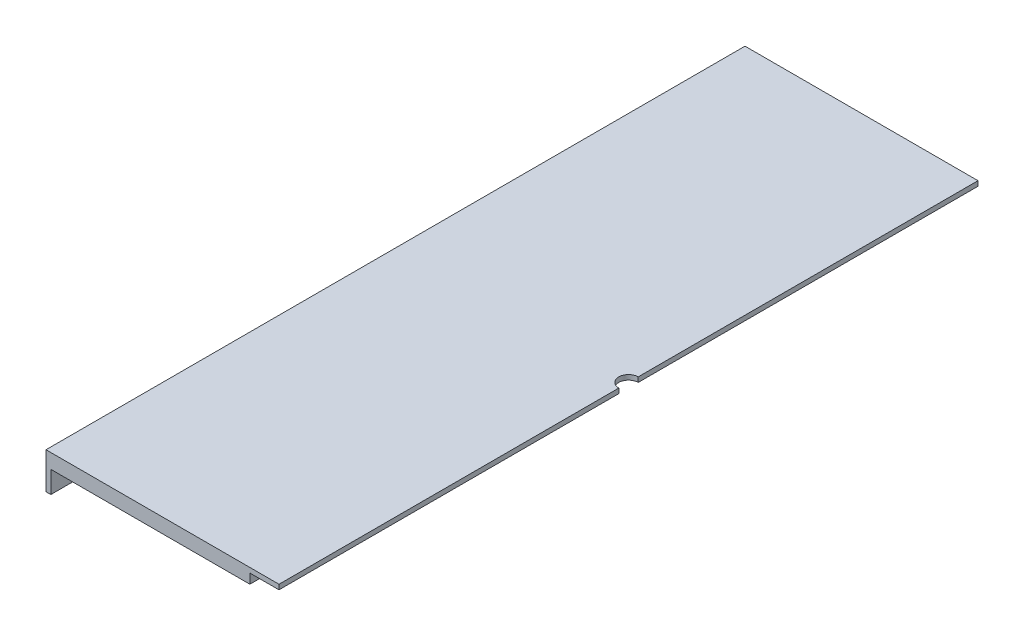
ISO-10303-21;
HEADER;
FILE_DESCRIPTION(('STEP AP214'),'2;1');
FILE_NAME('part.step','',(''),(''),'','','');
FILE_SCHEMA(('AUTOMOTIVE_DESIGN { 1 0 10303 214 1 1 1 1 }'));
ENDSEC;
DATA;
#1=APPLICATION_CONTEXT('core data for automotive mechanical design processes');
#2=APPLICATION_PROTOCOL_DEFINITION('international standard','automotive_design',2000,#1);
#3=PRODUCT_CONTEXT('',#1,'mechanical');
#4=PRODUCT('Part','Part','',(#3));
#5=PRODUCT_RELATED_PRODUCT_CATEGORY('part','',(#4));
#6=PRODUCT_DEFINITION_FORMATION('','',#4);
#7=PRODUCT_DEFINITION_CONTEXT('part definition',#1,'design');
#8=PRODUCT_DEFINITION('design','',#6,#7);
#9=PRODUCT_DEFINITION_SHAPE('','',#8);
#10=(LENGTH_UNIT() NAMED_UNIT(*) SI_UNIT(.MILLI.,.METRE.));
#11=(NAMED_UNIT(*) PLANE_ANGLE_UNIT() SI_UNIT($,.RADIAN.));
#12=(NAMED_UNIT(*) SI_UNIT($,.STERADIAN.) SOLID_ANGLE_UNIT());
#13=UNCERTAINTY_MEASURE_WITH_UNIT(LENGTH_MEASURE(1.E-05),#10,'distance_accuracy_value','');
#14=(GEOMETRIC_REPRESENTATION_CONTEXT(3) GLOBAL_UNCERTAINTY_ASSIGNED_CONTEXT((#13)) GLOBAL_UNIT_ASSIGNED_CONTEXT((#10,
#11,#12)) REPRESENTATION_CONTEXT('',''));
#15=CARTESIAN_POINT('',(0.,0.,0.));
#16=DIRECTION('',(0.,0.,1.));
#17=DIRECTION('',(1.,0.,0.));
#18=AXIS2_PLACEMENT_3D('',#15,#16,#17);
#19=CARTESIAN_POINT('',(152.4,3.175,0.));
#20=DIRECTION('',(-1.,0.,0.));
#21=DIRECTION('',(0.,0.,1.));
#22=AXIS2_PLACEMENT_3D('',#19,#20,#21);
#23=PLANE('',#22);
#24=DIRECTION('',(0.,0.,-1.));
#25=VECTOR('',#24,1.);
#26=CARTESIAN_POINT('',(152.4,0.,0.));
#27=LINE('',#26,#25);
#28=CARTESIAN_POINT('',(152.4,0.,0.));
#29=VERTEX_POINT('',#28);
#30=CARTESIAN_POINT('',(152.4,0.,-222.25));
#31=VERTEX_POINT('',#30);
#32=EDGE_CURVE('E216',#29,#31,#27,.T.);
#33=ORIENTED_EDGE('',*,*,#32,.T.);
#34=DIRECTION('',(0.,1.,0.));
#35=VECTOR('',#34,1.);
#36=CARTESIAN_POINT('',(152.4,-20.6375,-222.25));
#37=LINE('',#36,#35);
#38=CARTESIAN_POINT('',(152.4,3.175,-222.25));
#39=VERTEX_POINT('',#38);
#40=EDGE_CURVE('E205',#31,#39,#37,.T.);
#41=ORIENTED_EDGE('',*,*,#40,.T.);
#42=DIRECTION('',(0.,0.,-1.));
#43=VECTOR('',#42,1.);
#44=CARTESIAN_POINT('',(152.4,3.175,0.));
#45=LINE('',#44,#43);
#46=CARTESIAN_POINT('',(152.4,3.175,0.));
#47=VERTEX_POINT('',#46);
#48=EDGE_CURVE('E214',#47,#39,#45,.T.);
#49=ORIENTED_EDGE('',*,*,#48,.F.);
#50=DIRECTION('',(0.,-1.,0.));
#51=VECTOR('',#50,1.);
#52=CARTESIAN_POINT('',(152.4,3.175,0.));
#53=LINE('',#52,#51);
#54=EDGE_CURVE('E245',#47,#29,#53,.T.);
#55=ORIENTED_EDGE('',*,*,#54,.T.);
#56=EDGE_LOOP('',(#33,#41,#49,#55));
#57=FACE_BOUND('',#56,.T.);
#58=ADVANCED_FACE('F34',(#57),#23,.F.);
#59=CARTESIAN_POINT('',(0.,0.,0.));
#60=DIRECTION('',(0.,-1.,0.));
#61=DIRECTION('',(0.,0.,-1.));
#62=AXIS2_PLACEMENT_3D('',#59,#60,#61);
#63=PLANE('',#62);
#64=DIRECTION('',(-1.,0.,0.));
#65=VECTOR('',#64,1.);
#66=CARTESIAN_POINT('',(133.35,0.,-454.025));
#67=LINE('',#66,#65);
#68=CARTESIAN_POINT('',(130.175,0.,-454.025));
#69=VERTEX_POINT('',#68);
#70=CARTESIAN_POINT('',(3.17500000000007,0.,-454.025));
#71=VERTEX_POINT('',#70);
#72=EDGE_CURVE('E409',#69,#71,#67,.T.);
#73=ORIENTED_EDGE('',*,*,#72,.F.);
#74=DIRECTION('',(0.,0.,-1.));
#75=VECTOR('',#74,1.);
#76=CARTESIAN_POINT('',(130.175,0.,0.));
#77=LINE('',#76,#75);
#78=CARTESIAN_POINT('',(130.175,0.,-350.8375));
#79=VERTEX_POINT('',#78);
#80=EDGE_CURVE('E217',#79,#69,#77,.T.);
#81=ORIENTED_EDGE('',*,*,#80,.F.);
#82=DIRECTION('',(1.,0.,0.));
#83=VECTOR('',#82,1.);
#84=CARTESIAN_POINT('',(133.35,0.,-350.8375));
#85=LINE('',#84,#83);
#86=CARTESIAN_POINT('',(3.17500000000004,0.,-350.8375));
#87=VERTEX_POINT('',#86);
#88=EDGE_CURVE('E349',#87,#79,#85,.T.);
#89=ORIENTED_EDGE('',*,*,#88,.F.);
#90=DIRECTION('',(0.,0.,1.));
#91=VECTOR('',#90,1.);
#92=CARTESIAN_POINT('',(3.1749999999999,0.,0.));
#93=LINE('',#92,#91);
#94=EDGE_CURVE('E250',#71,#87,#93,.T.);
#95=ORIENTED_EDGE('',*,*,#94,.F.);
#96=EDGE_LOOP('',(#73,#81,#89,#95));
#97=FACE_BOUND('',#96,.T.);
#98=ADVANCED_FACE('F434',(#97),#63,.T.);
#99=DIRECTION('',(-1.,0.,0.));
#100=VECTOR('',#99,1.);
#101=CARTESIAN_POINT('',(133.35,0.,-347.6625));
#102=LINE('',#101,#100);
#103=CARTESIAN_POINT('',(130.175,0.,-347.6625));
#104=VERTEX_POINT('',#103);
#105=CARTESIAN_POINT('',(3.17500000000004,0.,-347.6625));
#106=VERTEX_POINT('',#105);
#107=EDGE_CURVE('E345',#104,#106,#102,.T.);
#108=ORIENTED_EDGE('',*,*,#107,.F.);
#109=CARTESIAN_POINT('',(130.175,0.,-230.1875));
#110=VERTEX_POINT('',#109);
#111=EDGE_CURVE('E455',#110,#104,#77,.T.);
#112=ORIENTED_EDGE('',*,*,#111,.F.);
#113=DIRECTION('',(1.,0.,0.));
#114=VECTOR('',#113,1.);
#115=CARTESIAN_POINT('',(133.35,0.,-230.1875));
#116=LINE('',#115,#114);
#117=CARTESIAN_POINT('',(3.17499999999998,0.,-230.1875));
#118=VERTEX_POINT('',#117);
#119=EDGE_CURVE('E368',#118,#110,#116,.T.);
#120=ORIENTED_EDGE('',*,*,#119,.F.);
#121=EDGE_CURVE('E253',#106,#118,#93,.T.);
#122=ORIENTED_EDGE('',*,*,#121,.F.);
#123=EDGE_LOOP('',(#108,#112,#120,#122));
#124=FACE_BOUND('',#123,.T.);
#125=ADVANCED_FACE('F453',(#124),#63,.T.);
#126=DIRECTION('',(-1.,0.,0.));
#127=VECTOR('',#126,1.);
#128=CARTESIAN_POINT('',(133.35,0.,-227.0125));
#129=LINE('',#128,#127);
#130=CARTESIAN_POINT('',(130.175,0.,-227.0125));
#131=VERTEX_POINT('',#130);
#132=CARTESIAN_POINT('',(3.17499999999998,0.,-227.0125));
#133=VERTEX_POINT('',#132);
#134=EDGE_CURVE('E364',#131,#133,#129,.T.);
#135=ORIENTED_EDGE('',*,*,#134,.F.);
#136=CARTESIAN_POINT('',(130.175,0.,-109.5375));
#137=VERTEX_POINT('',#136);
#138=EDGE_CURVE('E464',#137,#131,#77,.T.);
#139=ORIENTED_EDGE('',*,*,#138,.F.);
#140=DIRECTION('',(1.,0.,0.));
#141=VECTOR('',#140,1.);
#142=CARTESIAN_POINT('',(0.,0.,-109.5375));
#143=LINE('',#142,#141);
#144=CARTESIAN_POINT('',(3.17499999999994,0.,-109.5375));
#145=VERTEX_POINT('',#144);
#146=EDGE_CURVE('E291',#145,#137,#143,.T.);
#147=ORIENTED_EDGE('',*,*,#146,.F.);
#148=EDGE_CURVE('E266',#133,#145,#93,.T.);
#149=ORIENTED_EDGE('',*,*,#148,.F.);
#150=EDGE_LOOP('',(#135,#139,#147,#149));
#151=FACE_BOUND('',#150,.T.);
#152=ADVANCED_FACE('F384',(#151),#63,.T.);
#153=DIRECTION('',(-1.,0.,0.));
#154=VECTOR('',#153,1.);
#155=CARTESIAN_POINT('',(0.,0.,-106.3625));
#156=LINE('',#155,#154);
#157=CARTESIAN_POINT('',(130.175,0.,-106.3625));
#158=VERTEX_POINT('',#157);
#159=CARTESIAN_POINT('',(3.17499999999994,0.,-106.3625));
#160=VERTEX_POINT('',#159);
#161=EDGE_CURVE('E280',#158,#160,#156,.T.);
#162=ORIENTED_EDGE('',*,*,#161,.F.);
#163=CARTESIAN_POINT('',(130.175,0.,-3.175));
#164=VERTEX_POINT('',#163);
#165=EDGE_CURVE('E393',#164,#158,#77,.T.);
#166=ORIENTED_EDGE('',*,*,#165,.F.);
#167=DIRECTION('',(1.,0.,0.));
#168=VECTOR('',#167,1.);
#169=CARTESIAN_POINT('',(0.,0.,-3.175));
#170=LINE('',#169,#168);
#171=CARTESIAN_POINT('',(3.1749999999999,0.,-3.175));
#172=VERTEX_POINT('',#171);
#173=EDGE_CURVE('E335',#172,#164,#170,.T.);
#174=ORIENTED_EDGE('',*,*,#173,.F.);
#175=EDGE_CURVE('E249',#160,#172,#93,.T.);
#176=ORIENTED_EDGE('',*,*,#175,.F.);
#177=EDGE_LOOP('',(#162,#166,#174,#176));
#178=FACE_BOUND('',#177,.T.);
#179=ADVANCED_FACE('F391',(#178),#63,.T.);
#180=CARTESIAN_POINT('',(152.4,0.,-228.6));
#181=DIRECTION('',(0.,-1.,0.));
#182=DIRECTION('',(0.,0.,-1.));
#183=AXIS2_PLACEMENT_3D('',#180,#181,#182);
#184=CIRCLE('',#183,6.34999999999999);
#185=CARTESIAN_POINT('',(152.4,0.,-234.95));
#186=VERTEX_POINT('',#185);
#187=EDGE_CURVE('E218',#31,#186,#184,.T.);
#188=ORIENTED_EDGE('',*,*,#187,.F.);
#189=ORIENTED_EDGE('',*,*,#32,.F.);
#190=DIRECTION('',(1.,0.,0.));
#191=VECTOR('',#190,1.);
#192=CARTESIAN_POINT('',(0.,0.,0.));
#193=LINE('',#192,#191);
#194=CARTESIAN_POINT('',(133.35,0.,0.));
#195=VERTEX_POINT('',#194);
#196=EDGE_CURVE('E232',#195,#29,#193,.T.);
#197=ORIENTED_EDGE('',*,*,#196,.F.);
#198=DIRECTION('',(0.,0.,1.));
#199=VECTOR('',#198,1.);
#200=CARTESIAN_POINT('',(133.35,0.,-106.3625));
#201=LINE('',#200,#199);
#202=CARTESIAN_POINT('',(133.35,0.,-457.2));
#203=VERTEX_POINT('',#202);
#204=EDGE_CURVE('E283',#203,#195,#201,.T.);
#205=ORIENTED_EDGE('',*,*,#204,.F.);
#206=DIRECTION('',(-1.,0.,0.));
#207=VECTOR('',#206,1.);
#208=CARTESIAN_POINT('',(0.,0.,-457.2));
#209=LINE('',#208,#207);
#210=CARTESIAN_POINT('',(152.4,0.,-457.2));
#211=VERTEX_POINT('',#210);
#212=EDGE_CURVE('E237',#211,#203,#209,.T.);
#213=ORIENTED_EDGE('',*,*,#212,.F.);
#214=EDGE_CURVE('E234',#186,#211,#27,.T.);
#215=ORIENTED_EDGE('',*,*,#214,.F.);
#216=EDGE_LOOP('',(#188,#189,#197,#205,#213,#215));
#217=FACE_BOUND('',#216,.T.);
#218=ADVANCED_FACE('F497',(#217),#63,.T.);
#219=CARTESIAN_POINT('',(0.,-6.35,-109.5375));
#220=DIRECTION('',(0.,0.,1.));
#221=DIRECTION('',(1.,0.,0.));
#222=AXIS2_PLACEMENT_3D('',#219,#220,#221);
#223=PLANE('',#222);
#224=DIRECTION('',(0.,1.,0.));
#225=VECTOR('',#224,1.);
#226=CARTESIAN_POINT('',(130.175,-6.35,-109.5375));
#227=LINE('',#226,#225);
#228=CARTESIAN_POINT('',(130.175,-6.35000000000002,-109.5375));
#229=VERTEX_POINT('',#228);
#230=EDGE_CURVE('E278',#229,#137,#227,.T.);
#231=ORIENTED_EDGE('',*,*,#230,.F.);
#232=DIRECTION('',(1.,0.,0.));
#233=VECTOR('',#232,1.);
#234=CARTESIAN_POINT('',(0.,-6.35,-109.5375));
#235=LINE('',#234,#233);
#236=CARTESIAN_POINT('',(3.17499999999994,-6.35,-109.5375));
#237=VERTEX_POINT('',#236);
#238=EDGE_CURVE('E272',#237,#229,#235,.T.);
#239=ORIENTED_EDGE('',*,*,#238,.F.);
#240=DIRECTION('',(0.,-1.,0.));
#241=VECTOR('',#240,1.);
#242=CARTESIAN_POINT('',(3.17499999999994,-20.6375,-109.5375));
#243=LINE('',#242,#241);
#244=EDGE_CURVE('E42',#145,#237,#243,.T.);
#245=ORIENTED_EDGE('',*,*,#244,.F.);
#246=ORIENTED_EDGE('',*,*,#146,.T.);
#247=EDGE_LOOP('',(#231,#239,#245,#246));
#248=FACE_BOUND('',#247,.T.);
#249=ADVANCED_FACE('F277',(#248),#223,.F.);
#250=CARTESIAN_POINT('',(0.,-6.35,-106.3625));
#251=DIRECTION('',(0.,0.,-1.));
#252=DIRECTION('',(-1.,0.,0.));
#253=AXIS2_PLACEMENT_3D('',#250,#251,#252);
#254=PLANE('',#253);
#255=DIRECTION('',(0.,-1.,0.));
#256=VECTOR('',#255,1.);
#257=CARTESIAN_POINT('',(130.175,-6.35,-106.3625));
#258=LINE('',#257,#256);
#259=CARTESIAN_POINT('',(130.175,-6.35000000000002,-106.3625));
#260=VERTEX_POINT('',#259);
#261=EDGE_CURVE('E406',#158,#260,#258,.T.);
#262=ORIENTED_EDGE('',*,*,#261,.F.);
#263=ORIENTED_EDGE('',*,*,#161,.T.);
#264=DIRECTION('',(0.,1.,0.));
#265=VECTOR('',#264,1.);
#266=CARTESIAN_POINT('',(3.17499999999994,-20.6375,-106.3625));
#267=LINE('',#266,#265);
#268=CARTESIAN_POINT('',(3.17499999999994,-6.35,-106.3625));
#269=VERTEX_POINT('',#268);
#270=EDGE_CURVE('E256',#269,#160,#267,.T.);
#271=ORIENTED_EDGE('',*,*,#270,.F.);
#272=DIRECTION('',(-1.,0.,0.));
#273=VECTOR('',#272,1.);
#274=CARTESIAN_POINT('',(0.,-6.35,-106.3625));
#275=LINE('',#274,#273);
#276=EDGE_CURVE('E275',#260,#269,#275,.T.);
#277=ORIENTED_EDGE('',*,*,#276,.F.);
#278=EDGE_LOOP('',(#262,#263,#271,#277));
#279=FACE_BOUND('',#278,.T.);
#280=ADVANCED_FACE('F405',(#279),#254,.F.);
#281=CARTESIAN_POINT('',(133.35,-6.35,-227.0125));
#282=DIRECTION('',(0.,0.,-1.));
#283=DIRECTION('',(-1.,0.,0.));
#284=AXIS2_PLACEMENT_3D('',#281,#282,#283);
#285=PLANE('',#284);
#286=DIRECTION('',(0.,-1.,0.));
#287=VECTOR('',#286,1.);
#288=CARTESIAN_POINT('',(130.175,-6.35,-227.0125));
#289=LINE('',#288,#287);
#290=CARTESIAN_POINT('',(130.175,-6.35,-227.0125));
#291=VERTEX_POINT('',#290);
#292=EDGE_CURVE('E407',#131,#291,#289,.T.);
#293=ORIENTED_EDGE('',*,*,#292,.F.);
#294=ORIENTED_EDGE('',*,*,#134,.T.);
#295=DIRECTION('',(0.,1.,0.));
#296=VECTOR('',#295,1.);
#297=CARTESIAN_POINT('',(3.17499999999998,-20.6375,-227.0125));
#298=LINE('',#297,#296);
#299=CARTESIAN_POINT('',(3.17499999999998,-6.35,-227.0125));
#300=VERTEX_POINT('',#299);
#301=EDGE_CURVE('E286',#300,#133,#298,.T.);
#302=ORIENTED_EDGE('',*,*,#301,.F.);
#303=DIRECTION('',(-1.,0.,0.));
#304=VECTOR('',#303,1.);
#305=CARTESIAN_POINT('',(133.35,-6.35,-227.0125));
#306=LINE('',#305,#304);
#307=EDGE_CURVE('E365',#291,#300,#306,.T.);
#308=ORIENTED_EDGE('',*,*,#307,.F.);
#309=EDGE_LOOP('',(#293,#294,#302,#308));
#310=FACE_BOUND('',#309,.T.);
#311=ADVANCED_FACE('F461',(#310),#285,.F.);
#312=CARTESIAN_POINT('',(133.35,-6.35,-230.1875));
#313=DIRECTION('',(0.,0.,1.));
#314=DIRECTION('',(1.,0.,0.));
#315=AXIS2_PLACEMENT_3D('',#312,#313,#314);
#316=PLANE('',#315);
#317=DIRECTION('',(0.,1.,0.));
#318=VECTOR('',#317,1.);
#319=CARTESIAN_POINT('',(130.175,-6.35,-230.1875));
#320=LINE('',#319,#318);
#321=CARTESIAN_POINT('',(130.175,-6.35000000000002,-230.1875));
#322=VERTEX_POINT('',#321);
#323=EDGE_CURVE('E411',#322,#110,#320,.T.);
#324=ORIENTED_EDGE('',*,*,#323,.F.);
#325=DIRECTION('',(1.,0.,0.));
#326=VECTOR('',#325,1.);
#327=CARTESIAN_POINT('',(133.35,-6.35,-230.1875));
#328=LINE('',#327,#326);
#329=CARTESIAN_POINT('',(3.17499999999998,-6.35,-230.1875));
#330=VERTEX_POINT('',#329);
#331=EDGE_CURVE('E367',#330,#322,#328,.T.);
#332=ORIENTED_EDGE('',*,*,#331,.F.);
#333=DIRECTION('',(0.,-1.,0.));
#334=VECTOR('',#333,1.);
#335=CARTESIAN_POINT('',(3.17499999999998,-20.6375,-230.1875));
#336=LINE('',#335,#334);
#337=EDGE_CURVE('E376',#118,#330,#336,.T.);
#338=ORIENTED_EDGE('',*,*,#337,.F.);
#339=ORIENTED_EDGE('',*,*,#119,.T.);
#340=EDGE_LOOP('',(#324,#332,#338,#339));
#341=FACE_BOUND('',#340,.T.);
#342=ADVANCED_FACE('F459',(#341),#316,.F.);
#343=CARTESIAN_POINT('',(133.35,-6.35,-347.6625));
#344=DIRECTION('',(0.,0.,-1.));
#345=DIRECTION('',(-1.,0.,0.));
#346=AXIS2_PLACEMENT_3D('',#343,#344,#345);
#347=PLANE('',#346);
#348=DIRECTION('',(0.,-1.,0.));
#349=VECTOR('',#348,1.);
#350=CARTESIAN_POINT('',(130.175,-6.35,-347.6625));
#351=LINE('',#350,#349);
#352=CARTESIAN_POINT('',(130.175,-6.35,-347.6625));
#353=VERTEX_POINT('',#352);
#354=EDGE_CURVE('E450',#104,#353,#351,.T.);
#355=ORIENTED_EDGE('',*,*,#354,.F.);
#356=ORIENTED_EDGE('',*,*,#107,.T.);
#357=DIRECTION('',(0.,1.,0.));
#358=VECTOR('',#357,1.);
#359=CARTESIAN_POINT('',(3.17500000000003,-20.6375,-347.6625));
#360=LINE('',#359,#358);
#361=CARTESIAN_POINT('',(3.17500000000003,-6.35,-347.6625));
#362=VERTEX_POINT('',#361);
#363=EDGE_CURVE('E361',#362,#106,#360,.T.);
#364=ORIENTED_EDGE('',*,*,#363,.F.);
#365=DIRECTION('',(-1.,0.,0.));
#366=VECTOR('',#365,1.);
#367=CARTESIAN_POINT('',(133.35,-6.35,-347.6625));
#368=LINE('',#367,#366);
#369=EDGE_CURVE('E346',#353,#362,#368,.T.);
#370=ORIENTED_EDGE('',*,*,#369,.F.);
#371=EDGE_LOOP('',(#355,#356,#364,#370));
#372=FACE_BOUND('',#371,.T.);
#373=ADVANCED_FACE('F448',(#372),#347,.F.);
#374=CARTESIAN_POINT('',(133.35,-6.35,-350.8375));
#375=DIRECTION('',(0.,0.,1.));
#376=DIRECTION('',(1.,0.,0.));
#377=AXIS2_PLACEMENT_3D('',#374,#375,#376);
#378=PLANE('',#377);
#379=DIRECTION('',(0.,1.,0.));
#380=VECTOR('',#379,1.);
#381=CARTESIAN_POINT('',(130.175,-6.35,-350.8375));
#382=LINE('',#381,#380);
#383=CARTESIAN_POINT('',(130.175,-6.35000000000002,-350.8375));
#384=VERTEX_POINT('',#383);
#385=EDGE_CURVE('E440',#384,#79,#382,.T.);
#386=ORIENTED_EDGE('',*,*,#385,.F.);
#387=DIRECTION('',(1.,0.,0.));
#388=VECTOR('',#387,1.);
#389=CARTESIAN_POINT('',(133.35,-6.35,-350.8375));
#390=LINE('',#389,#388);
#391=CARTESIAN_POINT('',(3.17500000000004,-6.35,-350.8375));
#392=VERTEX_POINT('',#391);
#393=EDGE_CURVE('E348',#392,#384,#390,.T.);
#394=ORIENTED_EDGE('',*,*,#393,.F.);
#395=DIRECTION('',(0.,-1.,0.));
#396=VECTOR('',#395,1.);
#397=CARTESIAN_POINT('',(3.17500000000003,-20.6375,-350.8375));
#398=LINE('',#397,#396);
#399=EDGE_CURVE('E358',#87,#392,#398,.T.);
#400=ORIENTED_EDGE('',*,*,#399,.F.);
#401=ORIENTED_EDGE('',*,*,#88,.T.);
#402=EDGE_LOOP('',(#386,#394,#400,#401));
#403=FACE_BOUND('',#402,.T.);
#404=ADVANCED_FACE('F438',(#403),#378,.F.);
#405=CARTESIAN_POINT('',(0.,-6.35,-3.175));
#406=DIRECTION('',(0.,0.,1.));
#407=DIRECTION('',(1.,0.,0.));
#408=AXIS2_PLACEMENT_3D('',#405,#406,#407);
#409=PLANE('',#408);
#410=DIRECTION('',(0.,1.,0.));
#411=VECTOR('',#410,1.);
#412=CARTESIAN_POINT('',(130.175,-6.35,-3.175));
#413=LINE('',#412,#411);
#414=CARTESIAN_POINT('',(130.175,-6.35000000000002,-3.175));
#415=VERTEX_POINT('',#414);
#416=EDGE_CURVE('E398',#415,#164,#413,.T.);
#417=ORIENTED_EDGE('',*,*,#416,.F.);
#418=DIRECTION('',(1.,0.,0.));
#419=VECTOR('',#418,1.);
#420=CARTESIAN_POINT('',(0.,-6.35,-3.175));
#421=LINE('',#420,#419);
#422=CARTESIAN_POINT('',(3.1749999999999,-6.35,-3.175));
#423=VERTEX_POINT('',#422);
#424=EDGE_CURVE('E331',#423,#415,#421,.T.);
#425=ORIENTED_EDGE('',*,*,#424,.F.);
#426=DIRECTION('',(0.,-1.,0.));
#427=VECTOR('',#426,1.);
#428=CARTESIAN_POINT('',(3.1749999999999,-20.6375,-3.17499999999998));
#429=LINE('',#428,#427);
#430=EDGE_CURVE('E343',#172,#423,#429,.T.);
#431=ORIENTED_EDGE('',*,*,#430,.F.);
#432=ORIENTED_EDGE('',*,*,#173,.T.);
#433=EDGE_LOOP('',(#417,#425,#431,#432));
#434=FACE_BOUND('',#433,.T.);
#435=ADVANCED_FACE('F396',(#434),#409,.F.);
#436=CARTESIAN_POINT('',(133.35,-6.35,-454.025));
#437=DIRECTION('',(0.,0.,-1.));
#438=DIRECTION('',(-1.,0.,0.));
#439=AXIS2_PLACEMENT_3D('',#436,#437,#438);
#440=PLANE('',#439);
#441=DIRECTION('',(0.,-1.,0.));
#442=VECTOR('',#441,1.);
#443=CARTESIAN_POINT('',(130.175,-6.35,-454.025));
#444=LINE('',#443,#442);
#445=CARTESIAN_POINT('',(130.175,-6.35,-454.025));
#446=VERTEX_POINT('',#445);
#447=EDGE_CURVE('E467',#69,#446,#444,.T.);
#448=ORIENTED_EDGE('',*,*,#447,.F.);
#449=ORIENTED_EDGE('',*,*,#72,.T.);
#450=DIRECTION('',(0.,1.,0.));
#451=VECTOR('',#450,1.);
#452=CARTESIAN_POINT('',(3.17500000000007,-20.6375,-454.025));
#453=LINE('',#452,#451);
#454=CARTESIAN_POINT('',(3.17500000000007,-6.35,-454.025));
#455=VERTEX_POINT('',#454);
#456=EDGE_CURVE('E340',#455,#71,#453,.T.);
#457=ORIENTED_EDGE('',*,*,#456,.F.);
#458=DIRECTION('',(-1.,0.,0.));
#459=VECTOR('',#458,1.);
#460=CARTESIAN_POINT('',(133.35,-6.35,-454.025));
#461=LINE('',#460,#459);
#462=EDGE_CURVE('E415',#446,#455,#461,.T.);
#463=ORIENTED_EDGE('',*,*,#462,.F.);
#464=EDGE_LOOP('',(#448,#449,#457,#463));
#465=FACE_BOUND('',#464,.T.);
#466=ADVANCED_FACE('F478',(#465),#440,.F.);
#467=CARTESIAN_POINT('',(3.17500000000007,-20.6375,-457.2));
#468=DIRECTION('',(1.,0.,0.));
#469=DIRECTION('',(0.,0.,-1.));
#470=AXIS2_PLACEMENT_3D('',#467,#468,#469);
#471=PLANE('',#470);
#472=DIRECTION('',(0.,0.,1.));
#473=VECTOR('',#472,1.);
#474=CARTESIAN_POINT('',(3.17500000000007,-6.35,-457.2));
#475=LINE('',#474,#473);
#476=CARTESIAN_POINT('',(3.17500000000007,-6.35,-457.2));
#477=VERTEX_POINT('',#476);
#478=EDGE_CURVE('E424',#477,#455,#475,.T.);
#479=ORIENTED_EDGE('',*,*,#478,.T.);
#480=ORIENTED_EDGE('',*,*,#456,.T.);
#481=ORIENTED_EDGE('',*,*,#94,.T.);
#482=ORIENTED_EDGE('',*,*,#399,.T.);
#483=DIRECTION('',(0.,0.,1.));
#484=VECTOR('',#483,1.);
#485=CARTESIAN_POINT('',(3.17500000000007,-6.35,-457.2));
#486=LINE('',#485,#484);
#487=EDGE_CURVE('E352',#392,#362,#486,.T.);
#488=ORIENTED_EDGE('',*,*,#487,.T.);
#489=ORIENTED_EDGE('',*,*,#363,.T.);
#490=ORIENTED_EDGE('',*,*,#121,.T.);
#491=ORIENTED_EDGE('',*,*,#337,.T.);
#492=DIRECTION('',(0.,0.,1.));
#493=VECTOR('',#492,1.);
#494=CARTESIAN_POINT('',(3.17500000000007,-6.35,-457.2));
#495=LINE('',#494,#493);
#496=EDGE_CURVE('E371',#330,#300,#495,.T.);
#497=ORIENTED_EDGE('',*,*,#496,.T.);
#498=ORIENTED_EDGE('',*,*,#301,.T.);
#499=ORIENTED_EDGE('',*,*,#148,.T.);
#500=ORIENTED_EDGE('',*,*,#244,.T.);
#501=DIRECTION('',(0.,0.,-1.));
#502=VECTOR('',#501,1.);
#503=CARTESIAN_POINT('',(3.17500000000007,-6.35,-457.2));
#504=LINE('',#503,#502);
#505=EDGE_CURVE('E252',#269,#237,#504,.T.);
#506=ORIENTED_EDGE('',*,*,#505,.F.);
#507=ORIENTED_EDGE('',*,*,#270,.T.);
#508=ORIENTED_EDGE('',*,*,#175,.T.);
#509=ORIENTED_EDGE('',*,*,#430,.T.);
#510=DIRECTION('',(0.,0.,-1.));
#511=VECTOR('',#510,1.);
#512=CARTESIAN_POINT('',(3.17500000000007,-6.35,-457.2));
#513=LINE('',#512,#511);
#514=CARTESIAN_POINT('',(3.1749999999999,-6.35,0.));
#515=VERTEX_POINT('',#514);
#516=EDGE_CURVE('E325',#515,#423,#513,.T.);
#517=ORIENTED_EDGE('',*,*,#516,.F.);
#518=DIRECTION('',(0.,1.,0.));
#519=VECTOR('',#518,1.);
#520=CARTESIAN_POINT('',(3.1749999999999,-20.6375,0.));
#521=LINE('',#520,#519);
#522=CARTESIAN_POINT('',(3.1749999999999,-20.6375,0.));
#523=VERTEX_POINT('',#522);
#524=EDGE_CURVE('E305',#523,#515,#521,.T.);
#525=ORIENTED_EDGE('',*,*,#524,.F.);
#526=DIRECTION('',(0.,0.,-1.));
#527=VECTOR('',#526,1.);
#528=CARTESIAN_POINT('',(3.17500000000007,-20.6375,-457.2));
#529=LINE('',#528,#527);
#530=CARTESIAN_POINT('',(3.17500000000007,-20.6375,-457.2));
#531=VERTEX_POINT('',#530);
#532=EDGE_CURVE('E302',#523,#531,#529,.T.);
#533=ORIENTED_EDGE('',*,*,#532,.T.);
#534=DIRECTION('',(0.,1.,0.));
#535=VECTOR('',#534,1.);
#536=CARTESIAN_POINT('',(3.17500000000007,-20.6375,-457.2));
#537=LINE('',#536,#535);
#538=EDGE_CURVE('E235',#531,#477,#537,.T.);
#539=ORIENTED_EDGE('',*,*,#538,.T.);
#540=EDGE_LOOP('',(#479,#480,#481,#482,#488,#489,#490,#491,#497,#498,#499,#500,#506,#507,#508,
#509,#517,#525,#533,#539));
#541=FACE_BOUND('',#540,.T.);
#542=ADVANCED_FACE('F262',(#541),#471,.T.);
#543=CARTESIAN_POINT('',(0.,3.175,0.));
#544=DIRECTION('',(1.,0.,0.));
#545=DIRECTION('',(0.,0.,-1.));
#546=AXIS2_PLACEMENT_3D('',#543,#544,#545);
#547=PLANE('',#546);
#548=DIRECTION('',(0.,-1.,0.));
#549=VECTOR('',#548,1.);
#550=CARTESIAN_POINT('',(0.,3.175,-457.2));
#551=LINE('',#550,#549);
#552=CARTESIAN_POINT('',(0.,3.175,-457.2));
#553=VERTEX_POINT('',#552);
#554=CARTESIAN_POINT('',(0.,-20.6375,-457.2));
#555=VERTEX_POINT('',#554);
#556=EDGE_CURVE('E227',#553,#555,#551,.T.);
#557=ORIENTED_EDGE('',*,*,#556,.T.);
#558=DIRECTION('',(0.,0.,1.));
#559=VECTOR('',#558,1.);
#560=CARTESIAN_POINT('',(0.,-20.6375,-457.2));
#561=LINE('',#560,#559);
#562=CARTESIAN_POINT('',(0.,-20.6375,0.));
#563=VERTEX_POINT('',#562);
#564=EDGE_CURVE('E296',#555,#563,#561,.T.);
#565=ORIENTED_EDGE('',*,*,#564,.T.);
#566=DIRECTION('',(0.,-1.,0.));
#567=VECTOR('',#566,1.);
#568=CARTESIAN_POINT('',(0.,3.175,0.));
#569=LINE('',#568,#567);
#570=CARTESIAN_POINT('',(0.,3.175,0.));
#571=VERTEX_POINT('',#570);
#572=EDGE_CURVE('E247',#571,#563,#569,.T.);
#573=ORIENTED_EDGE('',*,*,#572,.F.);
#574=DIRECTION('',(0.,0.,1.));
#575=VECTOR('',#574,1.);
#576=CARTESIAN_POINT('',(0.,3.175,0.));
#577=LINE('',#576,#575);
#578=EDGE_CURVE('E240',#553,#571,#577,.T.);
#579=ORIENTED_EDGE('',*,*,#578,.F.);
#580=EDGE_LOOP('',(#557,#565,#573,#579));
#581=FACE_BOUND('',#580,.T.);
#582=ADVANCED_FACE('F36',(#581),#547,.F.);
#583=CARTESIAN_POINT('',(0.,3.175,0.));
#584=DIRECTION('',(0.,0.,-1.));
#585=DIRECTION('',(-1.,0.,0.));
#586=AXIS2_PLACEMENT_3D('',#583,#584,#585);
#587=PLANE('',#586);
#588=DIRECTION('',(0.,1.,0.));
#589=VECTOR('',#588,1.);
#590=CARTESIAN_POINT('',(133.35,-6.35,0.));
#591=LINE('',#590,#589);
#592=CARTESIAN_POINT('',(133.35,-6.35,0.));
#593=VERTEX_POINT('',#592);
#594=EDGE_CURVE('E329',#593,#195,#591,.T.);
#595=ORIENTED_EDGE('',*,*,#594,.T.);
#596=ORIENTED_EDGE('',*,*,#196,.T.);
#597=ORIENTED_EDGE('',*,*,#54,.F.);
#598=DIRECTION('',(1.,0.,0.));
#599=VECTOR('',#598,1.);
#600=CARTESIAN_POINT('',(0.,3.175,0.));
#601=LINE('',#600,#599);
#602=EDGE_CURVE('E222',#571,#47,#601,.T.);
#603=ORIENTED_EDGE('',*,*,#602,.F.);
#604=ORIENTED_EDGE('',*,*,#572,.T.);
#605=DIRECTION('',(1.,0.,0.));
#606=VECTOR('',#605,1.);
#607=CARTESIAN_POINT('',(0.,-20.6375,0.));
#608=LINE('',#607,#606);
#609=EDGE_CURVE('E299',#563,#523,#608,.T.);
#610=ORIENTED_EDGE('',*,*,#609,.T.);
#611=ORIENTED_EDGE('',*,*,#524,.T.);
#612=DIRECTION('',(-1.,0.,0.));
#613=VECTOR('',#612,1.);
#614=CARTESIAN_POINT('',(0.,-6.35,0.));
#615=LINE('',#614,#613);
#616=EDGE_CURVE('E327',#593,#515,#615,.T.);
#617=ORIENTED_EDGE('',*,*,#616,.F.);
#618=EDGE_LOOP('',(#595,#596,#597,#603,#604,#610,#611,#617));
#619=FACE_BOUND('',#618,.T.);
#620=ADVANCED_FACE('F318',(#619),#587,.F.);
#621=CARTESIAN_POINT('',(152.4,3.175,-234.95));
#622=VERTEX_POINT('',#621);
#623=CARTESIAN_POINT('',(152.4,3.175,-457.2));
#624=VERTEX_POINT('',#623);
#625=EDGE_CURVE('E225',#622,#624,#45,.T.);
#626=ORIENTED_EDGE('',*,*,#625,.F.);
#627=DIRECTION('',(0.,1.,0.));
#628=VECTOR('',#627,1.);
#629=CARTESIAN_POINT('',(152.4,-20.6375,-234.95));
#630=LINE('',#629,#628);
#631=EDGE_CURVE('E49',#622,#186,#630,.F.);
#632=ORIENTED_EDGE('',*,*,#631,.T.);
#633=ORIENTED_EDGE('',*,*,#214,.T.);
#634=DIRECTION('',(0.,-1.,0.));
#635=VECTOR('',#634,1.);
#636=CARTESIAN_POINT('',(152.4,3.175,-457.2));
#637=LINE('',#636,#635);
#638=EDGE_CURVE('E242',#624,#211,#637,.T.);
#639=ORIENTED_EDGE('',*,*,#638,.F.);
#640=EDGE_LOOP('',(#626,#632,#633,#639));
#641=FACE_BOUND('',#640,.T.);
#642=ADVANCED_FACE('F490',(#641),#23,.F.);
#643=CARTESIAN_POINT('',(0.,3.175,-457.2));
#644=DIRECTION('',(0.,0.,1.));
#645=DIRECTION('',(1.,0.,0.));
#646=AXIS2_PLACEMENT_3D('',#643,#644,#645);
#647=PLANE('',#646);
#648=ORIENTED_EDGE('',*,*,#212,.T.);
#649=DIRECTION('',(0.,1.,0.));
#650=VECTOR('',#649,1.);
#651=CARTESIAN_POINT('',(133.35,-6.35,-457.2));
#652=LINE('',#651,#650);
#653=CARTESIAN_POINT('',(133.35,-6.35,-457.2));
#654=VERTEX_POINT('',#653);
#655=EDGE_CURVE('E420',#654,#203,#652,.T.);
#656=ORIENTED_EDGE('',*,*,#655,.F.);
#657=DIRECTION('',(1.,0.,0.));
#658=VECTOR('',#657,1.);
#659=CARTESIAN_POINT('',(133.35,-6.35,-457.2));
#660=LINE('',#659,#658);
#661=EDGE_CURVE('E417',#477,#654,#660,.T.);
#662=ORIENTED_EDGE('',*,*,#661,.F.);
#663=ORIENTED_EDGE('',*,*,#538,.F.);
#664=DIRECTION('',(-1.,0.,0.));
#665=VECTOR('',#664,1.);
#666=CARTESIAN_POINT('',(0.,-20.6375,-457.2));
#667=LINE('',#666,#665);
#668=EDGE_CURVE('E290',#531,#555,#667,.T.);
#669=ORIENTED_EDGE('',*,*,#668,.T.);
#670=ORIENTED_EDGE('',*,*,#556,.F.);
#671=DIRECTION('',(-1.,0.,0.));
#672=VECTOR('',#671,1.);
#673=CARTESIAN_POINT('',(0.,3.175,-457.2));
#674=LINE('',#673,#672);
#675=EDGE_CURVE('E224',#624,#553,#674,.T.);
#676=ORIENTED_EDGE('',*,*,#675,.F.);
#677=ORIENTED_EDGE('',*,*,#638,.T.);
#678=EDGE_LOOP('',(#648,#656,#662,#663,#669,#670,#676,#677));
#679=FACE_BOUND('',#678,.T.);
#680=ADVANCED_FACE('F500',(#679),#647,.F.);
#681=CARTESIAN_POINT('',(0.,3.175,0.));
#682=DIRECTION('',(0.,-1.,0.));
#683=DIRECTION('',(0.,0.,-1.));
#684=AXIS2_PLACEMENT_3D('',#681,#682,#683);
#685=PLANE('',#684);
#686=ORIENTED_EDGE('',*,*,#48,.T.);
#687=CARTESIAN_POINT('',(152.4,3.175,-228.6));
#688=DIRECTION('',(0.,-1.,0.));
#689=DIRECTION('',(0.,0.,-1.));
#690=AXIS2_PLACEMENT_3D('',#687,#688,#689);
#691=CIRCLE('',#690,6.34999999999999);
#692=EDGE_CURVE('E12',#39,#622,#691,.T.);
#693=ORIENTED_EDGE('',*,*,#692,.T.);
#694=ORIENTED_EDGE('',*,*,#625,.T.);
#695=ORIENTED_EDGE('',*,*,#675,.T.);
#696=ORIENTED_EDGE('',*,*,#578,.T.);
#697=ORIENTED_EDGE('',*,*,#602,.T.);
#698=EDGE_LOOP('',(#686,#693,#694,#695,#696,#697));
#699=FACE_BOUND('',#698,.T.);
#700=ADVANCED_FACE('F220',(#699),#685,.F.);
#701=CARTESIAN_POINT('',(0.,-20.6375,0.));
#702=DIRECTION('',(0.,-1.,0.));
#703=DIRECTION('',(0.,0.,-1.));
#704=AXIS2_PLACEMENT_3D('',#701,#702,#703);
#705=PLANE('',#704);
#706=ORIENTED_EDGE('',*,*,#668,.F.);
#707=ORIENTED_EDGE('',*,*,#532,.F.);
#708=ORIENTED_EDGE('',*,*,#609,.F.);
#709=ORIENTED_EDGE('',*,*,#564,.F.);
#710=EDGE_LOOP('',(#706,#707,#708,#709));
#711=FACE_BOUND('',#710,.T.);
#712=ADVANCED_FACE('F322',(#711),#705,.T.);
#713=CARTESIAN_POINT('',(133.35,-6.35,-106.3625));
#714=DIRECTION('',(-1.,0.,0.));
#715=DIRECTION('',(0.,0.,1.));
#716=AXIS2_PLACEMENT_3D('',#713,#714,#715);
#717=PLANE('',#716);
#718=ORIENTED_EDGE('',*,*,#204,.T.);
#719=ORIENTED_EDGE('',*,*,#594,.F.);
#720=DIRECTION('',(0.,0.,1.));
#721=VECTOR('',#720,1.);
#722=CARTESIAN_POINT('',(133.35,-6.35,-106.3625));
#723=LINE('',#722,#721);
#724=EDGE_CURVE('E279',#654,#593,#723,.T.);
#725=ORIENTED_EDGE('',*,*,#724,.F.);
#726=ORIENTED_EDGE('',*,*,#655,.T.);
#727=EDGE_LOOP('',(#718,#719,#725,#726));
#728=FACE_BOUND('',#727,.T.);
#729=ADVANCED_FACE('F513',(#728),#717,.F.);
#730=CARTESIAN_POINT('',(0.,-6.35,0.));
#731=DIRECTION('',(0.,-1.,0.));
#732=DIRECTION('',(0.,0.,-1.));
#733=AXIS2_PLACEMENT_3D('',#730,#731,#732);
#734=PLANE('',#733);
#735=ORIENTED_EDGE('',*,*,#724,.T.);
#736=ORIENTED_EDGE('',*,*,#616,.T.);
#737=ORIENTED_EDGE('',*,*,#516,.T.);
#738=ORIENTED_EDGE('',*,*,#424,.T.);
#739=DIRECTION('',(0.,0.,1.));
#740=VECTOR('',#739,1.);
#741=CARTESIAN_POINT('',(130.175,-6.35000000000002,0.));
#742=LINE('',#741,#740);
#743=EDGE_CURVE('E399',#260,#415,#742,.T.);
#744=ORIENTED_EDGE('',*,*,#743,.F.);
#745=ORIENTED_EDGE('',*,*,#276,.T.);
#746=ORIENTED_EDGE('',*,*,#505,.T.);
#747=ORIENTED_EDGE('',*,*,#238,.T.);
#748=EDGE_CURVE('E56',#291,#229,#742,.T.);
#749=ORIENTED_EDGE('',*,*,#748,.F.);
#750=ORIENTED_EDGE('',*,*,#307,.T.);
#751=ORIENTED_EDGE('',*,*,#496,.F.);
#752=ORIENTED_EDGE('',*,*,#331,.T.);
#753=EDGE_CURVE('E444',#353,#322,#742,.T.);
#754=ORIENTED_EDGE('',*,*,#753,.F.);
#755=ORIENTED_EDGE('',*,*,#369,.T.);
#756=ORIENTED_EDGE('',*,*,#487,.F.);
#757=ORIENTED_EDGE('',*,*,#393,.T.);
#758=EDGE_CURVE('E402',#446,#384,#742,.T.);
#759=ORIENTED_EDGE('',*,*,#758,.F.);
#760=ORIENTED_EDGE('',*,*,#462,.T.);
#761=ORIENTED_EDGE('',*,*,#478,.F.);
#762=ORIENTED_EDGE('',*,*,#661,.T.);
#763=EDGE_LOOP('',(#735,#736,#737,#738,#744,#745,#746,#747,#749,#750,#751,#752,#754,#755,#756,
#757,#759,#760,#761,#762));
#764=FACE_BOUND('',#763,.T.);
#765=ADVANCED_FACE('F271',(#764),#734,.T.);
#766=CARTESIAN_POINT('',(130.175,-463.561024172646,0.));
#767=DIRECTION('',(1.,0.,0.));
#768=DIRECTION('',(0.,0.,-1.));
#769=AXIS2_PLACEMENT_3D('',#766,#767,#768);
#770=PLANE('',#769);
#771=ORIENTED_EDGE('',*,*,#758,.T.);
#772=ORIENTED_EDGE('',*,*,#385,.T.);
#773=ORIENTED_EDGE('',*,*,#80,.T.);
#774=ORIENTED_EDGE('',*,*,#447,.T.);
#775=EDGE_LOOP('',(#771,#772,#773,#774));
#776=FACE_BOUND('',#775,.T.);
#777=ADVANCED_FACE('F475',(#776),#770,.F.);
#778=ORIENTED_EDGE('',*,*,#165,.T.);
#779=ORIENTED_EDGE('',*,*,#261,.T.);
#780=ORIENTED_EDGE('',*,*,#743,.T.);
#781=ORIENTED_EDGE('',*,*,#416,.T.);
#782=EDGE_LOOP('',(#778,#779,#780,#781));
#783=FACE_BOUND('',#782,.T.);
#784=ADVANCED_FACE('F593',(#783),#770,.F.);
#785=ORIENTED_EDGE('',*,*,#753,.T.);
#786=ORIENTED_EDGE('',*,*,#323,.T.);
#787=ORIENTED_EDGE('',*,*,#111,.T.);
#788=ORIENTED_EDGE('',*,*,#354,.T.);
#789=EDGE_LOOP('',(#785,#786,#787,#788));
#790=FACE_BOUND('',#789,.T.);
#791=ADVANCED_FACE('F473',(#790),#770,.F.);
#792=ORIENTED_EDGE('',*,*,#748,.T.);
#793=ORIENTED_EDGE('',*,*,#230,.T.);
#794=ORIENTED_EDGE('',*,*,#138,.T.);
#795=ORIENTED_EDGE('',*,*,#292,.T.);
#796=EDGE_LOOP('',(#792,#793,#794,#795));
#797=FACE_BOUND('',#796,.T.);
#798=ADVANCED_FACE('F463',(#797),#770,.F.);
#799=CARTESIAN_POINT('',(152.4,-20.6375,-228.6));
#800=DIRECTION('',(0.,1.,0.));
#801=DIRECTION('',(0.,0.,1.));
#802=AXIS2_PLACEMENT_3D('',#799,#800,#801);
#803=CYLINDRICAL_SURFACE('',#802,6.34999999999999);
#804=ORIENTED_EDGE('',*,*,#187,.T.);
#805=ORIENTED_EDGE('',*,*,#631,.F.);
#806=ORIENTED_EDGE('',*,*,#692,.F.);
#807=ORIENTED_EDGE('',*,*,#40,.F.);
#808=EDGE_LOOP('',(#804,#805,#806,#807));
#809=FACE_BOUND('',#808,.T.);
#810=ADVANCED_FACE('F204',(#809),#803,.F.);
#811=CLOSED_SHELL('',(#58,#98,#125,#152,#179,#218,#249,#280,#311,#342,#373,#404,#435,#466,#542,
#582,#620,#642,#680,#700,#712,#729,#765,#777,#784,#791,#798,#810));
#812=MANIFOLD_SOLID_BREP('B2',#811);
#813=ADVANCED_BREP_SHAPE_REPRESENTATION('',(#18,#812),#14);
#814=SHAPE_DEFINITION_REPRESENTATION(#9,#813);
ENDSEC;
END-ISO-10303-21;
